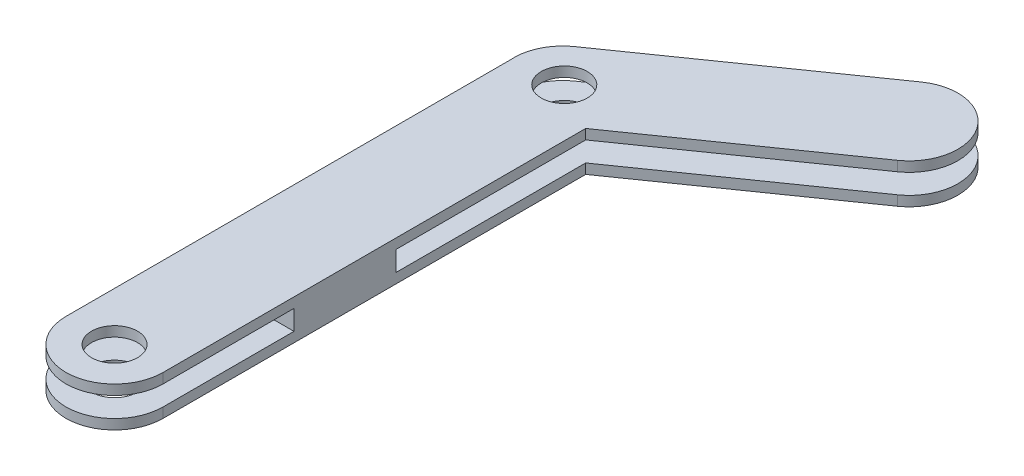
ISO-10303-21;
HEADER;
FILE_DESCRIPTION(('STEP AP214'),'2;1');
FILE_NAME('part.step','',(''),(''),'','','');
FILE_SCHEMA(('AUTOMOTIVE_DESIGN { 1 0 10303 214 1 1 1 1 }'));
ENDSEC;
DATA;
#1=APPLICATION_CONTEXT('core data for automotive mechanical design processes');
#2=APPLICATION_PROTOCOL_DEFINITION('international standard','automotive_design',2000,#1);
#3=PRODUCT_CONTEXT('',#1,'mechanical');
#4=PRODUCT('Part','Part','',(#3));
#5=PRODUCT_RELATED_PRODUCT_CATEGORY('part','',(#4));
#6=PRODUCT_DEFINITION_FORMATION('','',#4);
#7=PRODUCT_DEFINITION_CONTEXT('part definition',#1,'design');
#8=PRODUCT_DEFINITION('design','',#6,#7);
#9=PRODUCT_DEFINITION_SHAPE('','',#8);
#10=(LENGTH_UNIT() NAMED_UNIT(*) SI_UNIT(.MILLI.,.METRE.));
#11=(NAMED_UNIT(*) PLANE_ANGLE_UNIT() SI_UNIT($,.RADIAN.));
#12=(NAMED_UNIT(*) SI_UNIT($,.STERADIAN.) SOLID_ANGLE_UNIT());
#13=UNCERTAINTY_MEASURE_WITH_UNIT(LENGTH_MEASURE(1.E-05),#10,'distance_accuracy_value','');
#14=(GEOMETRIC_REPRESENTATION_CONTEXT(3) GLOBAL_UNCERTAINTY_ASSIGNED_CONTEXT((#13)) GLOBAL_UNIT_ASSIGNED_CONTEXT((#10,
#11,#12)) REPRESENTATION_CONTEXT('',''));
#15=CARTESIAN_POINT('',(0.,0.,0.));
#16=DIRECTION('',(0.,0.,1.));
#17=DIRECTION('',(1.,0.,0.));
#18=AXIS2_PLACEMENT_3D('',#15,#16,#17);
#19=CARTESIAN_POINT('',(19.5,4.,0.));
#20=DIRECTION('',(-1.,0.,0.));
#21=DIRECTION('',(0.,0.,1.));
#22=AXIS2_PLACEMENT_3D('',#19,#20,#21);
#23=PLANE('',#22);
#24=DIRECTION('',(0.,-1.,0.));
#25=VECTOR('',#24,1.);
#26=CARTESIAN_POINT('',(19.5,4.,-169.775998729933));
#27=LINE('',#26,#25);
#28=CARTESIAN_POINT('',(19.5,4.,-169.775998729933));
#29=VERTEX_POINT('',#28);
#30=CARTESIAN_POINT('',(19.5,0.,-169.775998729933));
#31=VERTEX_POINT('',#30);
#32=EDGE_CURVE('E191',#29,#31,#27,.T.);
#33=ORIENTED_EDGE('',*,*,#32,.F.);
#34=DIRECTION('',(0.,0.,-1.));
#35=VECTOR('',#34,1.);
#36=CARTESIAN_POINT('',(19.5,4.,0.));
#37=LINE('',#36,#35);
#38=CARTESIAN_POINT('',(19.5,4.,0.));
#39=VERTEX_POINT('',#38);
#40=EDGE_CURVE('E306',#39,#29,#37,.T.);
#41=ORIENTED_EDGE('',*,*,#40,.F.);
#42=DIRECTION('',(0.,-1.,0.));
#43=VECTOR('',#42,1.);
#44=CARTESIAN_POINT('',(19.5,4.,0.));
#45=LINE('',#44,#43);
#46=CARTESIAN_POINT('',(19.5,0.,0.));
#47=VERTEX_POINT('',#46);
#48=EDGE_CURVE('E11',#39,#47,#45,.T.);
#49=ORIENTED_EDGE('',*,*,#48,.T.);
#50=DIRECTION('',(0.,0.,-1.));
#51=VECTOR('',#50,1.);
#52=CARTESIAN_POINT('',(19.5,0.,0.));
#53=LINE('',#52,#51);
#54=CARTESIAN_POINT('',(19.5,0.,-52.5871104580105));
#55=VERTEX_POINT('',#54);
#56=EDGE_CURVE('E316',#47,#55,#53,.T.);
#57=ORIENTED_EDGE('',*,*,#56,.T.);
#58=DIRECTION('',(0.,1.,0.));
#59=VECTOR('',#58,1.);
#60=CARTESIAN_POINT('',(19.5,-4.,-52.5871104580105));
#61=LINE('',#60,#59);
#62=CARTESIAN_POINT('',(19.5,-8.,-52.5871104580105));
#63=VERTEX_POINT('',#62);
#64=EDGE_CURVE('E292',#63,#55,#61,.T.);
#65=ORIENTED_EDGE('',*,*,#64,.F.);
#66=DIRECTION('',(0.,0.,-1.));
#67=VECTOR('',#66,1.);
#68=CARTESIAN_POINT('',(19.5,-8.,0.));
#69=LINE('',#68,#67);
#70=CARTESIAN_POINT('',(19.5,-8.,0.));
#71=VERTEX_POINT('',#70);
#72=EDGE_CURVE('E273',#71,#63,#69,.T.);
#73=ORIENTED_EDGE('',*,*,#72,.F.);
#74=DIRECTION('',(0.,1.,0.));
#75=VECTOR('',#74,1.);
#76=CARTESIAN_POINT('',(19.5,-12.,0.));
#77=LINE('',#76,#75);
#78=CARTESIAN_POINT('',(19.5,-12.,0.));
#79=VERTEX_POINT('',#78);
#80=EDGE_CURVE('E280',#79,#71,#77,.T.);
#81=ORIENTED_EDGE('',*,*,#80,.F.);
#82=DIRECTION('',(0.,0.,-1.));
#83=VECTOR('',#82,1.);
#84=CARTESIAN_POINT('',(19.5,-12.,0.));
#85=LINE('',#84,#83);
#86=CARTESIAN_POINT('',(19.5,-12.,-169.775998729933));
#87=VERTEX_POINT('',#86);
#88=EDGE_CURVE('E264',#79,#87,#85,.T.);
#89=ORIENTED_EDGE('',*,*,#88,.T.);
#90=DIRECTION('',(0.,1.,0.));
#91=VECTOR('',#90,1.);
#92=CARTESIAN_POINT('',(19.5,4.,-169.775998729933));
#93=LINE('',#92,#91);
#94=CARTESIAN_POINT('',(19.5,-8.,-169.775998729933));
#95=VERTEX_POINT('',#94);
#96=EDGE_CURVE('E243',#87,#95,#93,.T.);
#97=ORIENTED_EDGE('',*,*,#96,.T.);
#98=CARTESIAN_POINT('',(19.5,-8.,-93.4927643749495));
#99=VERTEX_POINT('',#98);
#100=EDGE_CURVE('E272',#99,#95,#69,.T.);
#101=ORIENTED_EDGE('',*,*,#100,.F.);
#102=DIRECTION('',(0.,1.,0.));
#103=VECTOR('',#102,1.);
#104=CARTESIAN_POINT('',(19.5,-4.,-93.4927643749495));
#105=LINE('',#104,#103);
#106=CARTESIAN_POINT('',(19.5,0.,-93.4927643749495));
#107=VERTEX_POINT('',#106);
#108=EDGE_CURVE('E291',#99,#107,#105,.T.);
#109=ORIENTED_EDGE('',*,*,#108,.T.);
#110=EDGE_CURVE('E315',#107,#31,#53,.T.);
#111=ORIENTED_EDGE('',*,*,#110,.T.);
#112=EDGE_LOOP('',(#33,#41,#49,#57,#65,#73,#81,#89,#97,#101,#109,#111));
#113=FACE_BOUND('',#112,.T.);
#114=ADVANCED_FACE('F40',(#113),#23,.F.);
#115=CARTESIAN_POINT('',(-19.5,4.,0.));
#116=DIRECTION('',(1.,0.,0.));
#117=DIRECTION('',(0.,0.,-1.));
#118=AXIS2_PLACEMENT_3D('',#115,#116,#117);
#119=PLANE('',#118);
#120=DIRECTION('',(0.,1.,0.));
#121=VECTOR('',#120,1.);
#122=CARTESIAN_POINT('',(-19.5,0.,-178.55360679732));
#123=LINE('',#122,#121);
#124=CARTESIAN_POINT('',(-19.5,0.,-178.55360679732));
#125=VERTEX_POINT('',#124);
#126=CARTESIAN_POINT('',(-19.5,4.,-178.55360679732));
#127=VERTEX_POINT('',#126);
#128=EDGE_CURVE('E210',#125,#127,#123,.T.);
#129=ORIENTED_EDGE('',*,*,#128,.F.);
#130=DIRECTION('',(0.,0.,1.));
#131=VECTOR('',#130,1.);
#132=CARTESIAN_POINT('',(-19.5,0.,0.));
#133=LINE('',#132,#131);
#134=CARTESIAN_POINT('',(-19.5,0.,-93.4927643749495));
#135=VERTEX_POINT('',#134);
#136=EDGE_CURVE('E307',#125,#135,#133,.T.);
#137=ORIENTED_EDGE('',*,*,#136,.T.);
#138=DIRECTION('',(0.,1.,0.));
#139=VECTOR('',#138,1.);
#140=CARTESIAN_POINT('',(-19.5,-4.,-93.4927643749495));
#141=LINE('',#140,#139);
#142=CARTESIAN_POINT('',(-19.5,-8.,-93.4927643749495));
#143=VERTEX_POINT('',#142);
#144=EDGE_CURVE('E297',#143,#135,#141,.T.);
#145=ORIENTED_EDGE('',*,*,#144,.F.);
#146=DIRECTION('',(0.,0.,1.));
#147=VECTOR('',#146,1.);
#148=CARTESIAN_POINT('',(-19.5,-8.,0.));
#149=LINE('',#148,#147);
#150=CARTESIAN_POINT('',(-19.5,-8.,-178.55360679732));
#151=VERTEX_POINT('',#150);
#152=EDGE_CURVE('E64',#151,#143,#149,.T.);
#153=ORIENTED_EDGE('',*,*,#152,.F.);
#154=DIRECTION('',(0.,-1.,0.));
#155=VECTOR('',#154,1.);
#156=CARTESIAN_POINT('',(-19.5,-8.,-178.55360679732));
#157=LINE('',#156,#155);
#158=CARTESIAN_POINT('',(-19.5,-12.,-178.55360679732));
#159=VERTEX_POINT('',#158);
#160=EDGE_CURVE('E249',#151,#159,#157,.T.);
#161=ORIENTED_EDGE('',*,*,#160,.T.);
#162=DIRECTION('',(0.,0.,1.));
#163=VECTOR('',#162,1.);
#164=CARTESIAN_POINT('',(-19.5,-12.,0.));
#165=LINE('',#164,#163);
#166=CARTESIAN_POINT('',(-19.5,-12.,0.));
#167=VERTEX_POINT('',#166);
#168=EDGE_CURVE('E266',#159,#167,#165,.T.);
#169=ORIENTED_EDGE('',*,*,#168,.T.);
#170=DIRECTION('',(0.,1.,0.));
#171=VECTOR('',#170,1.);
#172=CARTESIAN_POINT('',(-19.5,-12.,0.));
#173=LINE('',#172,#171);
#174=CARTESIAN_POINT('',(-19.5,-8.,0.));
#175=VERTEX_POINT('',#174);
#176=EDGE_CURVE('E268',#167,#175,#173,.T.);
#177=ORIENTED_EDGE('',*,*,#176,.T.);
#178=CARTESIAN_POINT('',(-19.5,-8.,-52.5871104580105));
#179=VERTEX_POINT('',#178);
#180=EDGE_CURVE('E276',#179,#175,#149,.T.);
#181=ORIENTED_EDGE('',*,*,#180,.F.);
#182=DIRECTION('',(0.,1.,0.));
#183=VECTOR('',#182,1.);
#184=CARTESIAN_POINT('',(-19.5,-4.,-52.5871104580105));
#185=LINE('',#184,#183);
#186=CARTESIAN_POINT('',(-19.5,0.,-52.5871104580105));
#187=VERTEX_POINT('',#186);
#188=EDGE_CURVE('E295',#179,#187,#185,.T.);
#189=ORIENTED_EDGE('',*,*,#188,.T.);
#190=CARTESIAN_POINT('',(-19.5,0.,0.));
#191=VERTEX_POINT('',#190);
#192=EDGE_CURVE('E319',#187,#191,#133,.T.);
#193=ORIENTED_EDGE('',*,*,#192,.T.);
#194=DIRECTION('',(0.,-1.,0.));
#195=VECTOR('',#194,1.);
#196=CARTESIAN_POINT('',(-19.5,4.,0.));
#197=LINE('',#196,#195);
#198=CARTESIAN_POINT('',(-19.5,4.,0.));
#199=VERTEX_POINT('',#198);
#200=EDGE_CURVE('E49',#199,#191,#197,.T.);
#201=ORIENTED_EDGE('',*,*,#200,.F.);
#202=DIRECTION('',(0.,0.,1.));
#203=VECTOR('',#202,1.);
#204=CARTESIAN_POINT('',(-19.5,4.,0.));
#205=LINE('',#204,#203);
#206=EDGE_CURVE('E310',#127,#199,#205,.T.);
#207=ORIENTED_EDGE('',*,*,#206,.F.);
#208=EDGE_LOOP('',(#129,#137,#145,#153,#161,#169,#177,#181,#189,#193,#201,#207));
#209=FACE_BOUND('',#208,.T.);
#210=ADVANCED_FACE('F336',(#209),#119,.F.);
#211=CARTESIAN_POINT('',(0.,0.,0.));
#212=DIRECTION('',(0.,1.,0.));
#213=DIRECTION('',(0.,0.,1.));
#214=AXIS2_PLACEMENT_3D('',#211,#212,#213);
#215=PLANE('',#214);
#216=CARTESIAN_POINT('',(0.,0.,-180.667521799116));
#217=DIRECTION('',(0.,-1.,0.));
#218=DIRECTION('',(0.,0.,-1.));
#219=AXIS2_PLACEMENT_3D('',#216,#217,#218);
#220=CIRCLE('',#219,9.245);
#221=CARTESIAN_POINT('',(0.,0.,-189.912521799116));
#222=VERTEX_POINT('',#221);
#223=EDGE_CURVE('E201',#222,#222,#220,.T.);
#224=ORIENTED_EDGE('',*,*,#223,.F.);
#225=EDGE_LOOP('',(#224));
#226=FACE_BOUND('',#225,.T.);
#227=ORIENTED_EDGE('',*,*,#136,.F.);
#228=CARTESIAN_POINT('',(0.,0.,-180.));
#229=DIRECTION('',(0.,-1.,0.));
#230=DIRECTION('',(0.,0.,-1.));
#231=AXIS2_PLACEMENT_3D('',#228,#229,#230);
#232=CIRCLE('',#231,19.5535688122849);
#233=CARTESIAN_POINT('',(-11.2056731067415,0.,-196.024198685788));
#234=VERTEX_POINT('',#233);
#235=EDGE_CURVE('E192',#125,#234,#232,.T.);
#236=ORIENTED_EDGE('',*,*,#235,.T.);
#237=DIRECTION('',(0.819502508192801,0.,-0.573075596292241));
#238=VECTOR('',#237,1.);
#239=CARTESIAN_POINT('',(-11.2056731067415,0.,-196.024198685788));
#240=LINE('',#239,#238);
#241=CARTESIAN_POINT('',(70.7445777125386,0.,-253.331758315012));
#242=VERTEX_POINT('',#241);
#243=EDGE_CURVE('E175',#234,#242,#240,.T.);
#244=ORIENTED_EDGE('',*,*,#243,.T.);
#245=CARTESIAN_POINT('',(81.9502508192801,0.,-237.307559629224));
#246=DIRECTION('',(0.,-1.,0.));
#247=DIRECTION('',(0.,0.,-1.));
#248=AXIS2_PLACEMENT_3D('',#245,#246,#247);
#249=CIRCLE('',#248,19.5535688122849);
#250=CARTESIAN_POINT('',(93.1559239260217,0.,-221.283360943436));
#251=VERTEX_POINT('',#250);
#252=EDGE_CURVE('E166',#242,#251,#249,.T.);
#253=ORIENTED_EDGE('',*,*,#252,.T.);
#254=DIRECTION('',(-0.819502508192801,0.,0.573075596292241));
#255=VECTOR('',#254,1.);
#256=CARTESIAN_POINT('',(11.2056731067415,0.,-163.975801314212));
#257=LINE('',#256,#255);
#258=EDGE_CURVE('E172',#251,#31,#257,.T.);
#259=ORIENTED_EDGE('',*,*,#258,.T.);
#260=ORIENTED_EDGE('',*,*,#110,.F.);
#261=DIRECTION('',(-1.,0.,0.));
#262=VECTOR('',#261,1.);
#263=CARTESIAN_POINT('',(-19.5,0.,-93.4927643749495));
#264=LINE('',#263,#262);
#265=EDGE_CURVE('E283',#107,#135,#264,.T.);
#266=ORIENTED_EDGE('',*,*,#265,.T.);
#267=EDGE_LOOP('',(#227,#236,#244,#253,#259,#260,#266));
#268=FACE_BOUND('',#267,.T.);
#269=ADVANCED_FACE('F169',(#226,#268),#215,.F.);
#270=CARTESIAN_POINT('',(0.,4.,0.));
#271=DIRECTION('',(0.,-1.,0.));
#272=DIRECTION('',(0.,0.,-1.));
#273=AXIS2_PLACEMENT_3D('',#270,#271,#272);
#274=CYLINDRICAL_SURFACE('',#273,19.5);
#275=CARTESIAN_POINT('',(0.,0.,0.));
#276=DIRECTION('',(0.,1.,0.));
#277=DIRECTION('',(0.,0.,1.));
#278=AXIS2_PLACEMENT_3D('',#275,#276,#277);
#279=CIRCLE('',#278,19.5);
#280=EDGE_CURVE('E312',#191,#47,#279,.T.);
#281=ORIENTED_EDGE('',*,*,#280,.T.);
#282=ORIENTED_EDGE('',*,*,#48,.F.);
#283=CARTESIAN_POINT('',(0.,4.,0.));
#284=DIRECTION('',(0.,1.,0.));
#285=DIRECTION('',(0.,0.,1.));
#286=AXIS2_PLACEMENT_3D('',#283,#284,#285);
#287=CIRCLE('',#286,19.5);
#288=EDGE_CURVE('E303',#199,#39,#287,.T.);
#289=ORIENTED_EDGE('',*,*,#288,.F.);
#290=ORIENTED_EDGE('',*,*,#200,.T.);
#291=EDGE_LOOP('',(#281,#282,#289,#290));
#292=FACE_BOUND('',#291,.T.);
#293=ADVANCED_FACE('F42',(#292),#274,.T.);
#294=CARTESIAN_POINT('',(0.,4.,0.));
#295=DIRECTION('',(0.,1.,0.));
#296=DIRECTION('',(0.,0.,1.));
#297=AXIS2_PLACEMENT_3D('',#294,#295,#296);
#298=PLANE('',#297);
#299=CARTESIAN_POINT('',(0.,4.,-180.667521799116));
#300=DIRECTION('',(0.,-1.,0.));
#301=DIRECTION('',(0.,0.,-1.));
#302=AXIS2_PLACEMENT_3D('',#299,#300,#301);
#303=CIRCLE('',#302,9.245);
#304=CARTESIAN_POINT('',(0.,4.,-189.912521799116));
#305=VERTEX_POINT('',#304);
#306=EDGE_CURVE('E407',#305,#305,#303,.T.);
#307=ORIENTED_EDGE('',*,*,#306,.T.);
#308=EDGE_LOOP('',(#307));
#309=FACE_BOUND('',#308,.T.);
#310=ORIENTED_EDGE('',*,*,#40,.T.);
#311=DIRECTION('',(-0.819502508192801,0.,0.573075596292241));
#312=VECTOR('',#311,1.);
#313=CARTESIAN_POINT('',(11.2056731067415,4.,-163.975801314212));
#314=LINE('',#313,#312);
#315=CARTESIAN_POINT('',(93.1559239260217,4.,-221.283360943436));
#316=VERTEX_POINT('',#315);
#317=EDGE_CURVE('E200',#316,#29,#314,.T.);
#318=ORIENTED_EDGE('',*,*,#317,.F.);
#319=CARTESIAN_POINT('',(81.9502508192801,4.,-237.307559629224));
#320=DIRECTION('',(0.,-1.,0.));
#321=DIRECTION('',(0.,0.,-1.));
#322=AXIS2_PLACEMENT_3D('',#319,#320,#321);
#323=CIRCLE('',#322,19.5535688122849);
#324=CARTESIAN_POINT('',(70.7445777125386,4.,-253.331758315012));
#325=VERTEX_POINT('',#324);
#326=EDGE_CURVE('E184',#325,#316,#323,.T.);
#327=ORIENTED_EDGE('',*,*,#326,.F.);
#328=DIRECTION('',(0.819502508192801,0.,-0.573075596292241));
#329=VECTOR('',#328,1.);
#330=CARTESIAN_POINT('',(-11.2056731067415,4.,-196.024198685788));
#331=LINE('',#330,#329);
#332=CARTESIAN_POINT('',(-11.2056731067415,4.,-196.024198685788));
#333=VERTEX_POINT('',#332);
#334=EDGE_CURVE('E194',#333,#325,#331,.T.);
#335=ORIENTED_EDGE('',*,*,#334,.F.);
#336=CARTESIAN_POINT('',(0.,4.,-180.));
#337=DIRECTION('',(0.,-1.,0.));
#338=DIRECTION('',(0.,0.,-1.));
#339=AXIS2_PLACEMENT_3D('',#336,#337,#338);
#340=CIRCLE('',#339,19.5535688122849);
#341=EDGE_CURVE('E56',#127,#333,#340,.T.);
#342=ORIENTED_EDGE('',*,*,#341,.F.);
#343=ORIENTED_EDGE('',*,*,#206,.T.);
#344=ORIENTED_EDGE('',*,*,#288,.T.);
#345=EDGE_LOOP('',(#310,#318,#327,#335,#342,#343,#344));
#346=FACE_BOUND('',#345,.T.);
#347=CARTESIAN_POINT('',(0.,4.,0.));
#348=DIRECTION('',(0.,1.,0.));
#349=DIRECTION('',(0.,0.,1.));
#350=AXIS2_PLACEMENT_3D('',#347,#348,#349);
#351=CIRCLE('',#350,9.24284632932583);
#352=CARTESIAN_POINT('',(0.,4.,9.24284632932583));
#353=VERTEX_POINT('',#352);
#354=EDGE_CURVE('E294',#353,#353,#351,.T.);
#355=ORIENTED_EDGE('',*,*,#354,.F.);
#356=EDGE_LOOP('',(#355));
#357=FACE_BOUND('',#356,.T.);
#358=ADVANCED_FACE('F333',(#309,#346,#357),#298,.T.);
#359=CARTESIAN_POINT('',(0.,0.,0.));
#360=DIRECTION('',(0.,1.,0.));
#361=DIRECTION('',(0.,0.,1.));
#362=AXIS2_PLACEMENT_3D('',#359,#360,#361);
#363=CIRCLE('',#362,9.24284632932583);
#364=CARTESIAN_POINT('',(0.,0.,9.24284632932583));
#365=VERTEX_POINT('',#364);
#366=EDGE_CURVE('E44',#365,#365,#363,.T.);
#367=ORIENTED_EDGE('',*,*,#366,.T.);
#368=EDGE_LOOP('',(#367));
#369=FACE_BOUND('',#368,.T.);
#370=ORIENTED_EDGE('',*,*,#192,.F.);
#371=DIRECTION('',(1.,0.,0.));
#372=VECTOR('',#371,1.);
#373=CARTESIAN_POINT('',(-19.5,0.,-52.5871104580105));
#374=LINE('',#373,#372);
#375=EDGE_CURVE('E288',#187,#55,#374,.T.);
#376=ORIENTED_EDGE('',*,*,#375,.T.);
#377=ORIENTED_EDGE('',*,*,#56,.F.);
#378=ORIENTED_EDGE('',*,*,#280,.F.);
#379=EDGE_LOOP('',(#370,#376,#377,#378));
#380=FACE_BOUND('',#379,.T.);
#381=ADVANCED_FACE('F330',(#369,#380),#215,.F.);
#382=CARTESIAN_POINT('',(0.,-4.,0.));
#383=DIRECTION('',(0.,1.,0.));
#384=DIRECTION('',(0.,0.,1.));
#385=AXIS2_PLACEMENT_3D('',#382,#383,#384);
#386=CYLINDRICAL_SURFACE('',#385,9.24284632932583);
#387=ORIENTED_EDGE('',*,*,#354,.T.);
#388=EDGE_LOOP('',(#387));
#389=FACE_BOUND('',#388,.T.);
#390=ORIENTED_EDGE('',*,*,#366,.F.);
#391=EDGE_LOOP('',(#390));
#392=FACE_BOUND('',#391,.T.);
#393=ADVANCED_FACE('F381',(#389,#392),#386,.F.);
#394=CARTESIAN_POINT('',(-19.5,-4.,-52.5871104580105));
#395=DIRECTION('',(0.,0.,1.));
#396=DIRECTION('',(1.,0.,0.));
#397=AXIS2_PLACEMENT_3D('',#394,#395,#396);
#398=PLANE('',#397);
#399=ORIENTED_EDGE('',*,*,#375,.F.);
#400=ORIENTED_EDGE('',*,*,#188,.F.);
#401=DIRECTION('',(1.,0.,0.));
#402=VECTOR('',#401,1.);
#403=CARTESIAN_POINT('',(-19.5,-8.,-52.5871104580105));
#404=LINE('',#403,#402);
#405=EDGE_CURVE('E254',#179,#63,#404,.T.);
#406=ORIENTED_EDGE('',*,*,#405,.T.);
#407=ORIENTED_EDGE('',*,*,#64,.T.);
#408=EDGE_LOOP('',(#399,#400,#406,#407));
#409=FACE_BOUND('',#408,.T.);
#410=ADVANCED_FACE('F379',(#409),#398,.T.);
#411=CARTESIAN_POINT('',(-19.5,-4.,-93.4927643749495));
#412=DIRECTION('',(0.,0.,-1.));
#413=DIRECTION('',(-1.,0.,0.));
#414=AXIS2_PLACEMENT_3D('',#411,#412,#413);
#415=PLANE('',#414);
#416=ORIENTED_EDGE('',*,*,#265,.F.);
#417=ORIENTED_EDGE('',*,*,#108,.F.);
#418=DIRECTION('',(-1.,0.,0.));
#419=VECTOR('',#418,1.);
#420=CARTESIAN_POINT('',(-19.5,-8.,-93.4927643749495));
#421=LINE('',#420,#419);
#422=EDGE_CURVE('E251',#99,#143,#421,.T.);
#423=ORIENTED_EDGE('',*,*,#422,.T.);
#424=ORIENTED_EDGE('',*,*,#144,.T.);
#425=EDGE_LOOP('',(#416,#417,#423,#424));
#426=FACE_BOUND('',#425,.T.);
#427=ADVANCED_FACE('F340',(#426),#415,.T.);
#428=CARTESIAN_POINT('',(0.,-8.,0.));
#429=DIRECTION('',(0.,-1.,0.));
#430=DIRECTION('',(0.,0.,1.));
#431=AXIS2_PLACEMENT_3D('',#428,#429,#430);
#432=PLANE('',#431);
#433=CARTESIAN_POINT('',(0.,-8.,-180.667521799116));
#434=DIRECTION('',(0.,-1.,0.));
#435=DIRECTION('',(0.,0.,-1.));
#436=AXIS2_PLACEMENT_3D('',#433,#434,#435);
#437=CIRCLE('',#436,9.245);
#438=CARTESIAN_POINT('',(0.,-8.,-189.912521799116));
#439=VERTEX_POINT('',#438);
#440=EDGE_CURVE('E213',#439,#439,#437,.T.);
#441=ORIENTED_EDGE('',*,*,#440,.T.);
#442=EDGE_LOOP('',(#441));
#443=FACE_BOUND('',#442,.T.);
#444=ORIENTED_EDGE('',*,*,#100,.T.);
#445=DIRECTION('',(-0.819502508192801,0.,0.573075596292241));
#446=VECTOR('',#445,1.);
#447=CARTESIAN_POINT('',(11.2056731067415,-8.,-163.975801314212));
#448=LINE('',#447,#446);
#449=CARTESIAN_POINT('',(93.1559239260217,-8.,-221.283360943436));
#450=VERTEX_POINT('',#449);
#451=EDGE_CURVE('E228',#450,#95,#448,.T.);
#452=ORIENTED_EDGE('',*,*,#451,.F.);
#453=CARTESIAN_POINT('',(81.9502508192801,-8.,-237.307559629224));
#454=DIRECTION('',(0.,-1.,0.));
#455=DIRECTION('',(0.,0.,-1.));
#456=AXIS2_PLACEMENT_3D('',#453,#454,#455);
#457=CIRCLE('',#456,19.5535688122849);
#458=CARTESIAN_POINT('',(70.7445777125386,-8.,-253.331758315012));
#459=VERTEX_POINT('',#458);
#460=EDGE_CURVE('E225',#459,#450,#457,.T.);
#461=ORIENTED_EDGE('',*,*,#460,.F.);
#462=DIRECTION('',(0.819502508192801,0.,-0.573075596292241));
#463=VECTOR('',#462,1.);
#464=CARTESIAN_POINT('',(-11.2056731067415,-8.,-196.024198685788));
#465=LINE('',#464,#463);
#466=CARTESIAN_POINT('',(-11.2056731067415,-8.,-196.024198685788));
#467=VERTEX_POINT('',#466);
#468=EDGE_CURVE('E221',#467,#459,#465,.T.);
#469=ORIENTED_EDGE('',*,*,#468,.F.);
#470=CARTESIAN_POINT('',(0.,-8.,-180.));
#471=DIRECTION('',(0.,-1.,0.));
#472=DIRECTION('',(0.,0.,-1.));
#473=AXIS2_PLACEMENT_3D('',#470,#471,#472);
#474=CIRCLE('',#473,19.5535688122849);
#475=EDGE_CURVE('E219',#151,#467,#474,.T.);
#476=ORIENTED_EDGE('',*,*,#475,.F.);
#477=ORIENTED_EDGE('',*,*,#152,.T.);
#478=ORIENTED_EDGE('',*,*,#422,.F.);
#479=EDGE_LOOP('',(#444,#452,#461,#469,#476,#477,#478));
#480=FACE_BOUND('',#479,.T.);
#481=ADVANCED_FACE('F345',(#443,#480),#432,.F.);
#482=CARTESIAN_POINT('',(0.,-12.,0.));
#483=DIRECTION('',(0.,1.,0.));
#484=DIRECTION('',(0.,0.,-1.));
#485=AXIS2_PLACEMENT_3D('',#482,#483,#484);
#486=CYLINDRICAL_SURFACE('',#485,19.5);
#487=CARTESIAN_POINT('',(0.,-8.,0.));
#488=DIRECTION('',(0.,1.,0.));
#489=DIRECTION('',(0.,0.,1.));
#490=AXIS2_PLACEMENT_3D('',#487,#488,#489);
#491=CIRCLE('',#490,19.5);
#492=EDGE_CURVE('E269',#175,#71,#491,.T.);
#493=ORIENTED_EDGE('',*,*,#492,.F.);
#494=ORIENTED_EDGE('',*,*,#176,.F.);
#495=CARTESIAN_POINT('',(0.,-12.,0.));
#496=DIRECTION('',(0.,1.,0.));
#497=DIRECTION('',(0.,0.,1.));
#498=AXIS2_PLACEMENT_3D('',#495,#496,#497);
#499=CIRCLE('',#498,19.5);
#500=EDGE_CURVE('E261',#167,#79,#499,.T.);
#501=ORIENTED_EDGE('',*,*,#500,.T.);
#502=ORIENTED_EDGE('',*,*,#80,.T.);
#503=EDGE_LOOP('',(#493,#494,#501,#502));
#504=FACE_BOUND('',#503,.T.);
#505=ADVANCED_FACE('F373',(#504),#486,.T.);
#506=CARTESIAN_POINT('',(0.,-12.,0.));
#507=DIRECTION('',(0.,-1.,0.));
#508=DIRECTION('',(0.,0.,1.));
#509=AXIS2_PLACEMENT_3D('',#506,#507,#508);
#510=PLANE('',#509);
#511=CARTESIAN_POINT('',(0.,-12.,-180.667521799116));
#512=DIRECTION('',(0.,-1.,0.));
#513=DIRECTION('',(0.,0.,-1.));
#514=AXIS2_PLACEMENT_3D('',#511,#512,#513);
#515=CIRCLE('',#514,9.245);
#516=CARTESIAN_POINT('',(0.,-12.,-189.912521799116));
#517=VERTEX_POINT('',#516);
#518=EDGE_CURVE('E212',#517,#517,#515,.T.);
#519=ORIENTED_EDGE('',*,*,#518,.F.);
#520=EDGE_LOOP('',(#519));
#521=FACE_BOUND('',#520,.T.);
#522=DIRECTION('',(-0.819502508192801,0.,0.573075596292241));
#523=VECTOR('',#522,1.);
#524=CARTESIAN_POINT('',(11.2056731067415,-12.,-163.975801314212));
#525=LINE('',#524,#523);
#526=CARTESIAN_POINT('',(93.1559239260217,-12.,-221.283360943436));
#527=VERTEX_POINT('',#526);
#528=EDGE_CURVE('E222',#527,#87,#525,.T.);
#529=ORIENTED_EDGE('',*,*,#528,.T.);
#530=ORIENTED_EDGE('',*,*,#88,.F.);
#531=ORIENTED_EDGE('',*,*,#500,.F.);
#532=ORIENTED_EDGE('',*,*,#168,.F.);
#533=CARTESIAN_POINT('',(0.,-12.,-180.));
#534=DIRECTION('',(0.,-1.,0.));
#535=DIRECTION('',(0.,0.,-1.));
#536=AXIS2_PLACEMENT_3D('',#533,#534,#535);
#537=CIRCLE('',#536,19.5535688122849);
#538=CARTESIAN_POINT('',(-11.2056731067415,-12.,-196.024198685788));
#539=VERTEX_POINT('',#538);
#540=EDGE_CURVE('E216',#159,#539,#537,.T.);
#541=ORIENTED_EDGE('',*,*,#540,.T.);
#542=DIRECTION('',(0.819502508192801,0.,-0.573075596292241));
#543=VECTOR('',#542,1.);
#544=CARTESIAN_POINT('',(-11.2056731067415,-12.,-196.024198685788));
#545=LINE('',#544,#543);
#546=CARTESIAN_POINT('',(70.7445777125386,-12.,-253.331758315012));
#547=VERTEX_POINT('',#546);
#548=EDGE_CURVE('E233',#539,#547,#545,.T.);
#549=ORIENTED_EDGE('',*,*,#548,.T.);
#550=CARTESIAN_POINT('',(81.9502508192801,-12.,-237.307559629224));
#551=DIRECTION('',(0.,-1.,0.));
#552=DIRECTION('',(0.,0.,-1.));
#553=AXIS2_PLACEMENT_3D('',#550,#551,#552);
#554=CIRCLE('',#553,19.5535688122849);
#555=EDGE_CURVE('E236',#547,#527,#554,.T.);
#556=ORIENTED_EDGE('',*,*,#555,.T.);
#557=EDGE_LOOP('',(#529,#530,#531,#532,#541,#549,#556));
#558=FACE_BOUND('',#557,.T.);
#559=CARTESIAN_POINT('',(0.,-12.,0.));
#560=DIRECTION('',(0.,1.,0.));
#561=DIRECTION('',(0.,0.,1.));
#562=AXIS2_PLACEMENT_3D('',#559,#560,#561);
#563=CIRCLE('',#562,9.24284632932583);
#564=CARTESIAN_POINT('',(0.,-12.,9.24284632932583));
#565=VERTEX_POINT('',#564);
#566=EDGE_CURVE('E257',#565,#565,#563,.T.);
#567=ORIENTED_EDGE('',*,*,#566,.T.);
#568=EDGE_LOOP('',(#567));
#569=FACE_BOUND('',#568,.T.);
#570=ADVANCED_FACE('F354',(#521,#558,#569),#510,.T.);
#571=CARTESIAN_POINT('',(0.,-8.,0.));
#572=DIRECTION('',(0.,1.,0.));
#573=DIRECTION('',(0.,0.,1.));
#574=AXIS2_PLACEMENT_3D('',#571,#572,#573);
#575=CIRCLE('',#574,9.24284632932583);
#576=CARTESIAN_POINT('',(0.,-8.,9.24284632932583));
#577=VERTEX_POINT('',#576);
#578=EDGE_CURVE('E260',#577,#577,#575,.T.);
#579=ORIENTED_EDGE('',*,*,#578,.F.);
#580=EDGE_LOOP('',(#579));
#581=FACE_BOUND('',#580,.T.);
#582=ORIENTED_EDGE('',*,*,#180,.T.);
#583=ORIENTED_EDGE('',*,*,#492,.T.);
#584=ORIENTED_EDGE('',*,*,#72,.T.);
#585=ORIENTED_EDGE('',*,*,#405,.F.);
#586=EDGE_LOOP('',(#582,#583,#584,#585));
#587=FACE_BOUND('',#586,.T.);
#588=ADVANCED_FACE('F377',(#581,#587),#432,.F.);
#589=CARTESIAN_POINT('',(0.,-4.,0.));
#590=DIRECTION('',(0.,-1.,0.));
#591=DIRECTION('',(0.,0.,1.));
#592=AXIS2_PLACEMENT_3D('',#589,#590,#591);
#593=CYLINDRICAL_SURFACE('',#592,9.24284632932583);
#594=ORIENTED_EDGE('',*,*,#566,.F.);
#595=EDGE_LOOP('',(#594));
#596=FACE_BOUND('',#595,.T.);
#597=ORIENTED_EDGE('',*,*,#578,.T.);
#598=EDGE_LOOP('',(#597));
#599=FACE_BOUND('',#598,.T.);
#600=ADVANCED_FACE('F475',(#596,#599),#593,.F.);
#601=CARTESIAN_POINT('',(0.,-8.,-180.));
#602=DIRECTION('',(0.,-1.,0.));
#603=DIRECTION('',(0.,0.,-1.));
#604=AXIS2_PLACEMENT_3D('',#601,#602,#603);
#605=CYLINDRICAL_SURFACE('',#604,19.5535688122849);
#606=ORIENTED_EDGE('',*,*,#160,.F.);
#607=ORIENTED_EDGE('',*,*,#475,.T.);
#608=DIRECTION('',(0.,-1.,0.));
#609=VECTOR('',#608,1.);
#610=CARTESIAN_POINT('',(-11.2056731067415,-8.,-196.024198685788));
#611=LINE('',#610,#609);
#612=EDGE_CURVE('E231',#467,#539,#611,.T.);
#613=ORIENTED_EDGE('',*,*,#612,.T.);
#614=ORIENTED_EDGE('',*,*,#540,.F.);
#615=EDGE_LOOP('',(#606,#607,#613,#614));
#616=FACE_BOUND('',#615,.T.);
#617=ADVANCED_FACE('F368',(#616),#605,.T.);
#618=CARTESIAN_POINT('',(11.2056731067415,-8.,-163.975801314212));
#619=DIRECTION('',(0.573075596292241,0.,0.819502508192801));
#620=DIRECTION('',(0.819502508192801,0.,-0.573075596292241));
#621=AXIS2_PLACEMENT_3D('',#618,#619,#620);
#622=PLANE('',#621);
#623=ORIENTED_EDGE('',*,*,#96,.F.);
#624=ORIENTED_EDGE('',*,*,#528,.F.);
#625=DIRECTION('',(0.,-1.,0.));
#626=VECTOR('',#625,1.);
#627=CARTESIAN_POINT('',(93.1559239260217,-8.,-221.283360943436));
#628=LINE('',#627,#626);
#629=EDGE_CURVE('E241',#450,#527,#628,.T.);
#630=ORIENTED_EDGE('',*,*,#629,.F.);
#631=ORIENTED_EDGE('',*,*,#451,.T.);
#632=EDGE_LOOP('',(#623,#624,#630,#631));
#633=FACE_BOUND('',#632,.T.);
#634=ADVANCED_FACE('F352',(#633),#622,.T.);
#635=CARTESIAN_POINT('',(81.9502508192801,-8.,-237.307559629224));
#636=DIRECTION('',(0.,-1.,0.));
#637=DIRECTION('',(0.,0.,-1.));
#638=AXIS2_PLACEMENT_3D('',#635,#636,#637);
#639=CYLINDRICAL_SURFACE('',#638,19.5535688122849);
#640=ORIENTED_EDGE('',*,*,#555,.F.);
#641=DIRECTION('',(0.,-1.,0.));
#642=VECTOR('',#641,1.);
#643=CARTESIAN_POINT('',(70.7445777125386,-8.,-253.331758315012));
#644=LINE('',#643,#642);
#645=EDGE_CURVE('E244',#459,#547,#644,.T.);
#646=ORIENTED_EDGE('',*,*,#645,.F.);
#647=ORIENTED_EDGE('',*,*,#460,.T.);
#648=ORIENTED_EDGE('',*,*,#629,.T.);
#649=EDGE_LOOP('',(#640,#646,#647,#648));
#650=FACE_BOUND('',#649,.T.);
#651=ADVANCED_FACE('F360',(#650),#639,.T.);
#652=CARTESIAN_POINT('',(-11.2056731067415,-8.,-196.024198685788));
#653=DIRECTION('',(-0.573075596292241,0.,-0.819502508192801));
#654=DIRECTION('',(-0.819502508192801,0.,0.573075596292241));
#655=AXIS2_PLACEMENT_3D('',#652,#653,#654);
#656=PLANE('',#655);
#657=ORIENTED_EDGE('',*,*,#548,.F.);
#658=ORIENTED_EDGE('',*,*,#612,.F.);
#659=ORIENTED_EDGE('',*,*,#468,.T.);
#660=ORIENTED_EDGE('',*,*,#645,.T.);
#661=EDGE_LOOP('',(#657,#658,#659,#660));
#662=FACE_BOUND('',#661,.T.);
#663=ADVANCED_FACE('F365',(#662),#656,.T.);
#664=CARTESIAN_POINT('',(0.,-8.,-180.667521799116));
#665=DIRECTION('',(0.,-1.,0.));
#666=DIRECTION('',(0.,0.,-1.));
#667=AXIS2_PLACEMENT_3D('',#664,#665,#666);
#668=CYLINDRICAL_SURFACE('',#667,9.245);
#669=ORIENTED_EDGE('',*,*,#440,.F.);
#670=EDGE_LOOP('',(#669));
#671=FACE_BOUND('',#670,.T.);
#672=ORIENTED_EDGE('',*,*,#518,.T.);
#673=EDGE_LOOP('',(#672));
#674=FACE_BOUND('',#673,.T.);
#675=ADVANCED_FACE('F525',(#671,#674),#668,.F.);
#676=CARTESIAN_POINT('',(0.,0.,-180.));
#677=DIRECTION('',(0.,1.,0.));
#678=DIRECTION('',(0.,0.,1.));
#679=AXIS2_PLACEMENT_3D('',#676,#677,#678);
#680=CYLINDRICAL_SURFACE('',#679,19.5535688122849);
#681=ORIENTED_EDGE('',*,*,#235,.F.);
#682=ORIENTED_EDGE('',*,*,#128,.T.);
#683=ORIENTED_EDGE('',*,*,#341,.T.);
#684=DIRECTION('',(0.,1.,0.));
#685=VECTOR('',#684,1.);
#686=CARTESIAN_POINT('',(-11.2056731067415,0.,-196.024198685788));
#687=LINE('',#686,#685);
#688=EDGE_CURVE('E205',#234,#333,#687,.T.);
#689=ORIENTED_EDGE('',*,*,#688,.F.);
#690=EDGE_LOOP('',(#681,#682,#683,#689));
#691=FACE_BOUND('',#690,.T.);
#692=ADVANCED_FACE('F548',(#691),#680,.T.);
#693=CARTESIAN_POINT('',(11.2056731067415,0.,-163.975801314212));
#694=DIRECTION('',(-0.573075596292241,0.,-0.819502508192801));
#695=DIRECTION('',(-0.819502508192801,0.,0.573075596292241));
#696=AXIS2_PLACEMENT_3D('',#693,#694,#695);
#697=PLANE('',#696);
#698=ORIENTED_EDGE('',*,*,#317,.T.);
#699=ORIENTED_EDGE('',*,*,#32,.T.);
#700=ORIENTED_EDGE('',*,*,#258,.F.);
#701=DIRECTION('',(0.,1.,0.));
#702=VECTOR('',#701,1.);
#703=CARTESIAN_POINT('',(93.1559239260217,0.,-221.283360943436));
#704=LINE('',#703,#702);
#705=EDGE_CURVE('E181',#251,#316,#704,.T.);
#706=ORIENTED_EDGE('',*,*,#705,.T.);
#707=EDGE_LOOP('',(#698,#699,#700,#706));
#708=FACE_BOUND('',#707,.T.);
#709=ADVANCED_FACE('F189',(#708),#697,.F.);
#710=CARTESIAN_POINT('',(-11.2056731067415,0.,-196.024198685788));
#711=DIRECTION('',(0.573075596292241,0.,0.819502508192801));
#712=DIRECTION('',(0.819502508192801,0.,-0.573075596292241));
#713=AXIS2_PLACEMENT_3D('',#710,#711,#712);
#714=PLANE('',#713);
#715=ORIENTED_EDGE('',*,*,#334,.T.);
#716=DIRECTION('',(0.,1.,0.));
#717=VECTOR('',#716,1.);
#718=CARTESIAN_POINT('',(70.7445777125386,0.,-253.331758315012));
#719=LINE('',#718,#717);
#720=EDGE_CURVE('E187',#242,#325,#719,.T.);
#721=ORIENTED_EDGE('',*,*,#720,.F.);
#722=ORIENTED_EDGE('',*,*,#243,.F.);
#723=ORIENTED_EDGE('',*,*,#688,.T.);
#724=EDGE_LOOP('',(#715,#721,#722,#723));
#725=FACE_BOUND('',#724,.T.);
#726=ADVANCED_FACE('F618',(#725),#714,.F.);
#727=CARTESIAN_POINT('',(81.9502508192801,0.,-237.307559629224));
#728=DIRECTION('',(0.,1.,0.));
#729=DIRECTION('',(0.,0.,1.));
#730=AXIS2_PLACEMENT_3D('',#727,#728,#729);
#731=CYLINDRICAL_SURFACE('',#730,19.5535688122849);
#732=ORIENTED_EDGE('',*,*,#326,.T.);
#733=ORIENTED_EDGE('',*,*,#705,.F.);
#734=ORIENTED_EDGE('',*,*,#252,.F.);
#735=ORIENTED_EDGE('',*,*,#720,.T.);
#736=EDGE_LOOP('',(#732,#733,#734,#735));
#737=FACE_BOUND('',#736,.T.);
#738=ADVANCED_FACE('F182',(#737),#731,.T.);
#739=CARTESIAN_POINT('',(0.,0.,-180.667521799116));
#740=DIRECTION('',(0.,1.,0.));
#741=DIRECTION('',(0.,0.,1.));
#742=AXIS2_PLACEMENT_3D('',#739,#740,#741);
#743=CYLINDRICAL_SURFACE('',#742,9.245);
#744=ORIENTED_EDGE('',*,*,#223,.T.);
#745=EDGE_LOOP('',(#744));
#746=FACE_BOUND('',#745,.T.);
#747=ORIENTED_EDGE('',*,*,#306,.F.);
#748=EDGE_LOOP('',(#747));
#749=FACE_BOUND('',#748,.T.);
#750=ADVANCED_FACE('F413',(#746,#749),#743,.F.);
#751=CLOSED_SHELL('',(#114,#210,#269,#293,#358,#381,#393,#410,#427,#481,#505,#570,#588,#600,
#617,#634,#651,#663,#675,#692,#709,#726,#738,#750));
#752=MANIFOLD_SOLID_BREP('B2',#751);
#753=ADVANCED_BREP_SHAPE_REPRESENTATION('',(#18,#752),#14);
#754=SHAPE_DEFINITION_REPRESENTATION(#9,#753);
ENDSEC;
END-ISO-10303-21;
